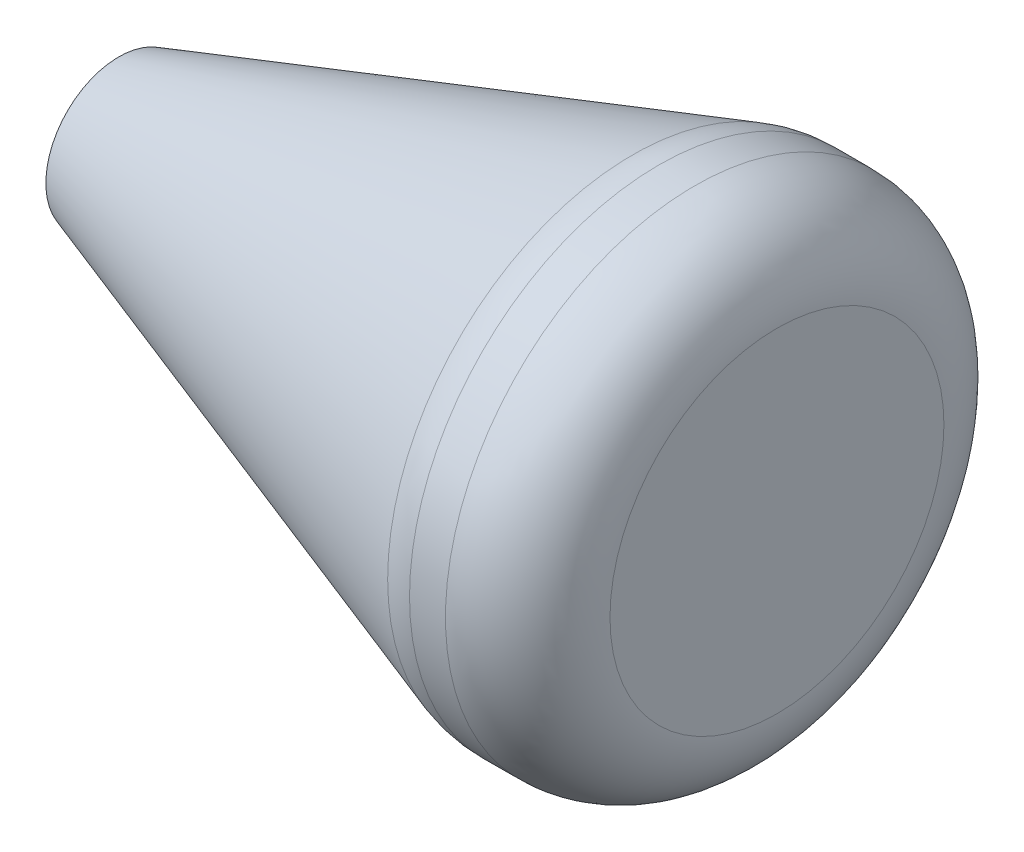
ISO-10303-21;
HEADER;
FILE_DESCRIPTION(('STEP AP214'),'2;1');
FILE_NAME('part.step','',(''),(''),'','','');
FILE_SCHEMA(('AUTOMOTIVE_DESIGN { 1 0 10303 214 1 1 1 1 }'));
ENDSEC;
DATA;
#1=APPLICATION_CONTEXT('core data for automotive mechanical design processes');
#2=APPLICATION_PROTOCOL_DEFINITION('international standard','automotive_design',2000,#1);
#3=PRODUCT_CONTEXT('',#1,'mechanical');
#4=PRODUCT('Part','Part','',(#3));
#5=PRODUCT_RELATED_PRODUCT_CATEGORY('part','',(#4));
#6=PRODUCT_DEFINITION_FORMATION('','',#4);
#7=PRODUCT_DEFINITION_CONTEXT('part definition',#1,'design');
#8=PRODUCT_DEFINITION('design','',#6,#7);
#9=PRODUCT_DEFINITION_SHAPE('','',#8);
#10=(LENGTH_UNIT() NAMED_UNIT(*) SI_UNIT(.MILLI.,.METRE.));
#11=(NAMED_UNIT(*) PLANE_ANGLE_UNIT() SI_UNIT($,.RADIAN.));
#12=(NAMED_UNIT(*) SI_UNIT($,.STERADIAN.) SOLID_ANGLE_UNIT());
#13=UNCERTAINTY_MEASURE_WITH_UNIT(LENGTH_MEASURE(1.E-05),#10,'distance_accuracy_value','');
#14=(GEOMETRIC_REPRESENTATION_CONTEXT(3) GLOBAL_UNCERTAINTY_ASSIGNED_CONTEXT((#13)) GLOBAL_UNIT_ASSIGNED_CONTEXT((#10,
#11,#12)) REPRESENTATION_CONTEXT('',''));
#15=CARTESIAN_POINT('',(0.,0.,0.));
#16=DIRECTION('',(0.,0.,1.));
#17=DIRECTION('',(1.,0.,0.));
#18=AXIS2_PLACEMENT_3D('',#15,#16,#17);
#19=CARTESIAN_POINT('',(0.,15.1490543444376,0.));
#20=DIRECTION('',(1.,0.,0.));
#21=DIRECTION('',(0.,0.,-1.));
#22=AXIS2_PLACEMENT_3D('',#19,#20,#21);
#23=PLANE('',#22);
#24=CARTESIAN_POINT('',(0.,0.,0.));
#25=DIRECTION('',(1.,0.,0.));
#26=DIRECTION('',(0.,0.,-1.));
#27=AXIS2_PLACEMENT_3D('',#24,#25,#26);
#28=CIRCLE('',#27,10.1490543444376);
#29=CARTESIAN_POINT('',(0.,0.,-10.1490543444376));
#30=VERTEX_POINT('',#29);
#31=EDGE_CURVE('E46',#30,#30,#28,.T.);
#32=ORIENTED_EDGE('',*,*,#31,.T.);
#33=EDGE_LOOP('',(#32));
#34=FACE_BOUND('',#33,.T.);
#35=ADVANCED_FACE('F39',(#34),#23,.T.);
#36=CARTESIAN_POINT('',(-6.,0.,0.));
#37=DIRECTION('',(-1.,0.,0.));
#38=DIRECTION('',(0.,0.,1.));
#39=AXIS2_PLACEMENT_3D('',#36,#37,#38);
#40=PLANE('',#39);
#41=CARTESIAN_POINT('',(-6.,0.,0.));
#42=DIRECTION('',(1.,0.,0.));
#43=DIRECTION('',(0.,0.,-1.));
#44=AXIS2_PLACEMENT_3D('',#41,#42,#43);
#45=CIRCLE('',#44,2.8);
#46=CARTESIAN_POINT('',(-6.,0.,-2.8));
#47=VERTEX_POINT('',#46);
#48=EDGE_CURVE('E59',#47,#47,#45,.T.);
#49=ORIENTED_EDGE('',*,*,#48,.F.);
#50=EDGE_LOOP('',(#49));
#51=FACE_BOUND('',#50,.T.);
#52=ADVANCED_FACE('F83',(#51),#40,.T.);
#53=CARTESIAN_POINT('',(0.,0.,0.));
#54=DIRECTION('',(1.,0.,0.));
#55=DIRECTION('',(0.,0.,-1.));
#56=AXIS2_PLACEMENT_3D('',#53,#54,#55);
#57=CYLINDRICAL_SURFACE('',#56,2.8);
#58=ORIENTED_EDGE('',*,*,#48,.T.);
#59=EDGE_LOOP('',(#58));
#60=FACE_BOUND('',#59,.T.);
#61=CARTESIAN_POINT('',(-40.,0.,0.));
#62=DIRECTION('',(1.,0.,0.));
#63=DIRECTION('',(0.,0.,-1.));
#64=AXIS2_PLACEMENT_3D('',#61,#62,#63);
#65=CIRCLE('',#64,2.8);
#66=CARTESIAN_POINT('',(-40.,0.,-2.8));
#67=VERTEX_POINT('',#66);
#68=EDGE_CURVE('E62',#67,#67,#65,.T.);
#69=ORIENTED_EDGE('',*,*,#68,.F.);
#70=EDGE_LOOP('',(#69));
#71=FACE_BOUND('',#70,.T.);
#72=ADVANCED_FACE('F73',(#60,#71),#57,.F.);
#73=CARTESIAN_POINT('',(-40.,2.8,0.));
#74=DIRECTION('',(-1.,0.,0.));
#75=DIRECTION('',(0.,0.,1.));
#76=AXIS2_PLACEMENT_3D('',#73,#74,#75);
#77=PLANE('',#76);
#78=ORIENTED_EDGE('',*,*,#68,.T.);
#79=EDGE_LOOP('',(#78));
#80=FACE_BOUND('',#79,.T.);
#81=CARTESIAN_POINT('',(-40.,0.,0.));
#82=DIRECTION('',(1.,0.,0.));
#83=DIRECTION('',(0.,0.,-1.));
#84=AXIS2_PLACEMENT_3D('',#81,#82,#83);
#85=CIRCLE('',#84,4.43789845075905);
#86=CARTESIAN_POINT('',(-40.,0.,-4.43789845075905));
#87=VERTEX_POINT('',#86);
#88=EDGE_CURVE('E65',#87,#87,#85,.T.);
#89=ORIENTED_EDGE('',*,*,#88,.F.);
#90=EDGE_LOOP('',(#89));
#91=FACE_BOUND('',#90,.T.);
#92=ADVANCED_FACE('F71',(#80,#91),#77,.T.);
#93=CARTESIAN_POINT('',(-8.,0.,0.));
#94=DIRECTION('',(1.,0.,0.));
#95=DIRECTION('',(0.,0.,-1.));
#96=AXIS2_PLACEMENT_3D('',#93,#94,#95);
#97=CONICAL_SURFACE('',#96,15.1490543444376,0.323001291588284);
#98=CARTESIAN_POINT('',(-8.77247254687889,0.,0.));
#99=DIRECTION('',(-1.,0.,0.));
#100=DIRECTION('',(0.,0.,1.));
#101=AXIS2_PLACEMENT_3D('',#98,#99,#100);
#102=CIRCLE('',#101,14.8904895358999);
#103=CARTESIAN_POINT('',(-8.77247254687889,0.,-14.8904895358999));
#104=VERTEX_POINT('',#103);
#105=EDGE_CURVE('E50',#104,#104,#102,.T.);
#106=CARTESIAN_POINT('',(-8.77247254687889,0.,-14.8904895358999));
#107=CARTESIAN_POINT('',(-9.09775929118223,0.,-14.781608378763));
#108=CARTESIAN_POINT('',(-9.42304603548557,0.,-14.6727272216262));
#109=CARTESIAN_POINT('',(-10.0736195240923,0.,-14.4549649073524));
#110=CARTESIAN_POINT('',(-10.3989062683956,0.,-14.3460837502155));
#111=CARTESIAN_POINT('',(-11.0494797570023,0.,-14.1283214359417));
#112=CARTESIAN_POINT('',(-11.3747665013056,0.,-14.0194402788049));
#113=CARTESIAN_POINT('',(-12.0253399899123,0.,-13.8016779645311));
#114=CARTESIAN_POINT('',(-12.3506267342157,0.,-13.6927968073942));
#115=CARTESIAN_POINT('',(-13.0012002228224,0.,-13.4750344931204));
#116=CARTESIAN_POINT('',(-13.3264869671257,0.,-13.3661533359836));
#117=CARTESIAN_POINT('',(-13.9770604557324,0.,-13.1483910217098));
#118=CARTESIAN_POINT('',(-14.3023472000358,0.,-13.0395098645729));
#119=CARTESIAN_POINT('',(-14.9529206886424,0.,-12.8217475502991));
#120=CARTESIAN_POINT('',(-15.2782074329458,0.,-12.7128663931622));
#121=CARTESIAN_POINT('',(-15.9287809215525,0.,-12.4951040788885));
#122=CARTESIAN_POINT('',(-16.2540676658558,0.,-12.3862229217516));
#123=CARTESIAN_POINT('',(-16.9046411544625,0.,-12.1684606074778));
#124=CARTESIAN_POINT('',(-17.2299278987659,0.,-12.0595794503409));
#125=CARTESIAN_POINT('',(-17.8805013873725,0.,-11.8418171360672));
#126=CARTESIAN_POINT('',(-18.2057881316759,0.,-11.7329359789303));
#127=CARTESIAN_POINT('',(-18.8563616202826,0.,-11.5151736646565));
#128=CARTESIAN_POINT('',(-19.1816483645859,0.,-11.4062925075196));
#129=CARTESIAN_POINT('',(-19.8322218531926,0.,-11.1885301932459));
#130=CARTESIAN_POINT('',(-20.157508597496,0.,-11.079649036109));
#131=CARTESIAN_POINT('',(-20.8080820861027,0.,-10.8618867218352));
#132=CARTESIAN_POINT('',(-21.133368830406,0.,-10.7530055646983));
#133=CARTESIAN_POINT('',(-21.7839423190127,0.,-10.5352432504246));
#134=CARTESIAN_POINT('',(-22.109229063316,0.,-10.4263620932877));
#135=CARTESIAN_POINT('',(-22.7598025519227,0.,-10.2085997790139));
#136=CARTESIAN_POINT('',(-23.0850892962261,0.,-10.099718621877));
#137=CARTESIAN_POINT('',(-23.7356627848328,0.,-9.88195630760326));
#138=CARTESIAN_POINT('',(-24.0609495291361,0.,-9.77307515046637));
#139=CARTESIAN_POINT('',(-24.7115230177428,0.,-9.55531283619261));
#140=CARTESIAN_POINT('',(-25.0368097620461,0.,-9.44643167905572));
#141=CARTESIAN_POINT('',(-25.6873832506528,0.,-9.22866936478195));
#142=CARTESIAN_POINT('',(-26.0126699949562,0.,-9.11978820764507));
#143=CARTESIAN_POINT('',(-26.6632434835629,0.,-8.9020258933713));
#144=CARTESIAN_POINT('',(-26.9885302278662,0.,-8.79314473623442));
#145=CARTESIAN_POINT('',(-27.6391037164729,0.,-8.57538242196065));
#146=CARTESIAN_POINT('',(-27.9643904607762,0.,-8.46650126482376));
#147=CARTESIAN_POINT('',(-28.6149639493829,0.,-8.24873895055));
#148=CARTESIAN_POINT('',(-28.9402506936863,0.,-8.13985779341311));
#149=CARTESIAN_POINT('',(-29.590824182293,0.,-7.92209547913934));
#150=CARTESIAN_POINT('',(-29.9161109265963,0.,-7.81321432200246));
#151=CARTESIAN_POINT('',(-30.566684415203,0.,-7.59545200772869));
#152=CARTESIAN_POINT('',(-30.8919711595064,0.,-7.4865708505918));
#153=CARTESIAN_POINT('',(-31.542544648113,0.,-7.26880853631804));
#154=CARTESIAN_POINT('',(-31.8678313924164,0.,-7.15992737918115));
#155=CARTESIAN_POINT('',(-32.5184048810231,0.,-6.94216506490738));
#156=CARTESIAN_POINT('',(-32.8436916253264,0.,-6.8332839077705));
#157=CARTESIAN_POINT('',(-33.4942651139331,0.,-6.61552159349673));
#158=CARTESIAN_POINT('',(-33.8195518582365,0.,-6.50664043635985));
#159=CARTESIAN_POINT('',(-34.4701253468431,0.,-6.28887812208608));
#160=CARTESIAN_POINT('',(-34.7954120911465,0.,-6.1799969649492));
#161=CARTESIAN_POINT('',(-35.4459855797532,0.,-5.96223465067543));
#162=CARTESIAN_POINT('',(-35.7712723240565,0.,-5.85335349353854));
#163=CARTESIAN_POINT('',(-36.4218458126632,0.,-5.63559117926477));
#164=CARTESIAN_POINT('',(-36.7471325569666,0.,-5.52671002212789));
#165=CARTESIAN_POINT('',(-37.3977060455733,0.,-5.30894770785412));
#166=CARTESIAN_POINT('',(-37.7229927898766,0.,-5.20006655071724));
#167=CARTESIAN_POINT('',(-38.3735662784833,0.,-4.98230423644347));
#168=CARTESIAN_POINT('',(-38.6988530227866,0.,-4.87342307930658));
#169=CARTESIAN_POINT('',(-39.3494265113933,0.,-4.65566076503282));
#170=CARTESIAN_POINT('',(-39.6747132556967,0.,-4.54677960789593));
#171=CARTESIAN_POINT('',(-40.,0.,-4.43789845075905));
#172=B_SPLINE_CURVE_WITH_KNOTS('',3,(#106,#107,#108,#109,#110,#111,#112,#113,#114,#115,#116,
#117,#118,#119,#120,#121,#122,#123,#124,#125,#126,#127,#128,#129,#130,#131,#132,#133,#134,#135,
#136,#137,#138,#139,#140,#141,#142,#143,#144,#145,#146,#147,#148,#149,#150,#151,#152,#153,#154,
#155,#156,#157,#158,#159,#160,#161,#162,#163,#164,#165,#166,#167,#168,#169,#170,#171),
.UNSPECIFIED.,.F.,.F.,(4,2,2,2,2,2,2,2,2,2,2,2,2,2,2,2,2,2,2,2,2,2,2,2,2,2,2,2,2,2,2,2,4),(0.,
1.02907684435635,2.05815368871271,3.08723053306906,4.11630737742541,5.14538422178176,
6.17446106613812,7.20353791049447,8.23261475485083,9.26169159920718,10.2907684435635,
11.3198452879199,12.3489221322762,13.3779989766326,14.4070758209889,15.4361526653453,
16.4652295097017,17.494306354058,18.5233831984144,19.5524600427707,20.5815368871271,
21.6106137314834,22.6396905758398,23.6687674201961,24.6978442645525,25.7269211089088,
26.7559979532652,27.7850747976215,28.8141516419779,29.8432284863343,30.8723053306906,
31.901382175047,32.9304590194033),.UNSPECIFIED.);
#173=EDGE_CURVE('BSEAM69',#104,#87,#172,.T.);
#174=ORIENTED_EDGE('',*,*,#105,.T.);
#175=ORIENTED_EDGE('',*,*,#88,.T.);
#176=ORIENTED_EDGE('',*,*,#173,.T.);
#177=ORIENTED_EDGE('',*,*,#173,.F.);
#178=EDGE_LOOP('',(#174,#176,#175,#177));
#179=FACE_BOUND('',#178,.T.);
#180=ADVANCED_FACE('F69',(#179),#97,.T.);
#181=CARTESIAN_POINT('',(0.,0.,0.));
#182=DIRECTION('',(1.,0.,0.));
#183=DIRECTION('',(0.,0.,-1.));
#184=AXIS2_PLACEMENT_3D('',#181,#182,#183);
#185=CYLINDRICAL_SURFACE('',#184,15.1490543444376);
#186=CARTESIAN_POINT('',(-5.,0.,0.));
#187=DIRECTION('',(1.,0.,0.));
#188=DIRECTION('',(0.,0.,-1.));
#189=AXIS2_PLACEMENT_3D('',#186,#187,#188);
#190=CIRCLE('',#189,15.1490543444376);
#191=CARTESIAN_POINT('',(-5.,0.,-15.1490543444376));
#192=VERTEX_POINT('',#191);
#193=EDGE_CURVE('E10',#192,#192,#190,.F.);
#194=ORIENTED_EDGE('',*,*,#193,.T.);
#195=EDGE_LOOP('',(#194));
#196=FACE_BOUND('',#195,.T.);
#197=CARTESIAN_POINT('',(-7.18540218764368,0.,0.));
#198=DIRECTION('',(-1.,0.,0.));
#199=DIRECTION('',(0.,0.,1.));
#200=AXIS2_PLACEMENT_3D('',#197,#198,#199);
#201=CIRCLE('',#200,15.1490543444376);
#202=CARTESIAN_POINT('',(-7.18540218764368,0.,15.1490543444376));
#203=VERTEX_POINT('',#202);
#204=EDGE_CURVE('E54',#203,#203,#201,.F.);
#205=ORIENTED_EDGE('',*,*,#204,.T.);
#206=EDGE_LOOP('',(#205));
#207=FACE_BOUND('',#206,.T.);
#208=ADVANCED_FACE('F80',(#196,#207),#185,.T.);
#209=CARTESIAN_POINT('',(-7.18540218764368,0.,0.));
#210=DIRECTION('',(-1.,0.,0.));
#211=DIRECTION('',(0.,0.,1.));
#212=AXIS2_PLACEMENT_3D('',#209,#210,#211);
#213=TOROIDAL_SURFACE('',#212,10.1490543444376,5.);
#214=ORIENTED_EDGE('',*,*,#105,.F.);
#215=EDGE_LOOP('',(#214));
#216=FACE_BOUND('',#215,.T.);
#217=ORIENTED_EDGE('',*,*,#204,.F.);
#218=EDGE_LOOP('',(#217));
#219=FACE_BOUND('',#218,.T.);
#220=ADVANCED_FACE('F95',(#216,#219),#213,.T.);
#221=CARTESIAN_POINT('',(-5.,0.,0.));
#222=DIRECTION('',(1.,0.,0.));
#223=DIRECTION('',(0.,0.,-1.));
#224=AXIS2_PLACEMENT_3D('',#221,#222,#223);
#225=TOROIDAL_SURFACE('',#224,10.1490543444376,5.);
#226=ORIENTED_EDGE('',*,*,#193,.F.);
#227=EDGE_LOOP('',(#226));
#228=FACE_BOUND('',#227,.T.);
#229=ORIENTED_EDGE('',*,*,#31,.F.);
#230=EDGE_LOOP('',(#229));
#231=FACE_BOUND('',#230,.T.);
#232=ADVANCED_FACE('F41',(#228,#231),#225,.T.);
#233=CLOSED_SHELL('',(#35,#52,#72,#92,#180,#208,#220,#232));
#234=MANIFOLD_SOLID_BREP('B2',#233);
#235=ADVANCED_BREP_SHAPE_REPRESENTATION('',(#18,#234),#14);
#236=SHAPE_DEFINITION_REPRESENTATION(#9,#235);
ENDSEC;
END-ISO-10303-21;
